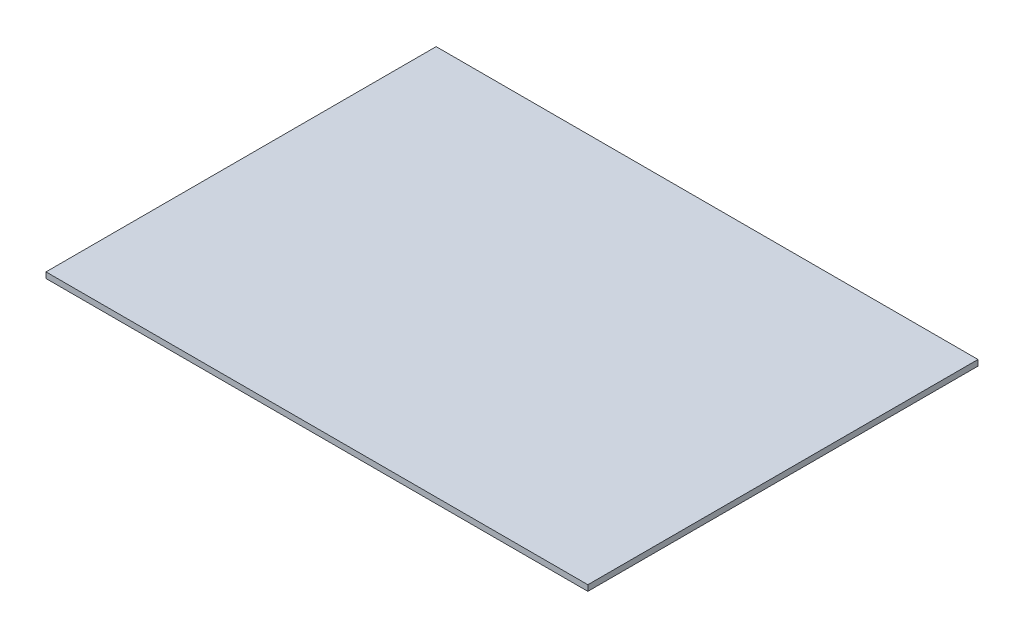
ISO-10303-21;
HEADER;
FILE_DESCRIPTION(('STEP AP214'),'2;1');
FILE_NAME('part.step','',(''),(''),'','','');
FILE_SCHEMA(('AUTOMOTIVE_DESIGN { 1 0 10303 214 1 1 1 1 }'));
ENDSEC;
DATA;
#1=APPLICATION_CONTEXT('core data for automotive mechanical design processes');
#2=APPLICATION_PROTOCOL_DEFINITION('international standard','automotive_design',2000,#1);
#3=PRODUCT_CONTEXT('',#1,'mechanical');
#4=PRODUCT('Part','Part','',(#3));
#5=PRODUCT_RELATED_PRODUCT_CATEGORY('part','',(#4));
#6=PRODUCT_DEFINITION_FORMATION('','',#4);
#7=PRODUCT_DEFINITION_CONTEXT('part definition',#1,'design');
#8=PRODUCT_DEFINITION('design','',#6,#7);
#9=PRODUCT_DEFINITION_SHAPE('','',#8);
#10=(LENGTH_UNIT() NAMED_UNIT(*) SI_UNIT(.MILLI.,.METRE.));
#11=(NAMED_UNIT(*) PLANE_ANGLE_UNIT() SI_UNIT($,.RADIAN.));
#12=(NAMED_UNIT(*) SI_UNIT($,.STERADIAN.) SOLID_ANGLE_UNIT());
#13=UNCERTAINTY_MEASURE_WITH_UNIT(LENGTH_MEASURE(1.E-05),#10,'distance_accuracy_value','');
#14=(GEOMETRIC_REPRESENTATION_CONTEXT(3) GLOBAL_UNCERTAINTY_ASSIGNED_CONTEXT((#13)) GLOBAL_UNIT_ASSIGNED_CONTEXT((#10,
#11,#12)) REPRESENTATION_CONTEXT('',''));
#15=CARTESIAN_POINT('',(0.,0.,0.));
#16=DIRECTION('',(0.,0.,1.));
#17=DIRECTION('',(1.,0.,0.));
#18=AXIS2_PLACEMENT_3D('',#15,#16,#17);
#19=CARTESIAN_POINT('',(75.,1.6,54.));
#20=DIRECTION('',(-1.,0.,0.));
#21=DIRECTION('',(0.,0.,1.));
#22=AXIS2_PLACEMENT_3D('',#19,#20,#21);
#23=PLANE('',#22);
#24=DIRECTION('',(0.,0.,-1.));
#25=VECTOR('',#24,1.);
#26=CARTESIAN_POINT('',(75.,0.,54.));
#27=LINE('',#26,#25);
#28=CARTESIAN_POINT('',(75.,0.,54.));
#29=VERTEX_POINT('',#28);
#30=CARTESIAN_POINT('',(75.,0.,-54.));
#31=VERTEX_POINT('',#30);
#32=EDGE_CURVE('E98',#29,#31,#27,.T.);
#33=ORIENTED_EDGE('',*,*,#32,.T.);
#34=DIRECTION('',(0.,-1.,0.));
#35=VECTOR('',#34,1.);
#36=CARTESIAN_POINT('',(75.,1.6,-54.));
#37=LINE('',#36,#35);
#38=CARTESIAN_POINT('',(75.,1.6,-54.));
#39=VERTEX_POINT('',#38);
#40=EDGE_CURVE('E11',#39,#31,#37,.T.);
#41=ORIENTED_EDGE('',*,*,#40,.F.);
#42=DIRECTION('',(0.,0.,-1.));
#43=VECTOR('',#42,1.);
#44=CARTESIAN_POINT('',(75.,1.6,54.));
#45=LINE('',#44,#43);
#46=CARTESIAN_POINT('',(75.,1.6,54.));
#47=VERTEX_POINT('',#46);
#48=EDGE_CURVE('E86',#47,#39,#45,.T.);
#49=ORIENTED_EDGE('',*,*,#48,.F.);
#50=DIRECTION('',(0.,-1.,0.));
#51=VECTOR('',#50,1.);
#52=CARTESIAN_POINT('',(75.,1.6,54.));
#53=LINE('',#52,#51);
#54=EDGE_CURVE('E94',#47,#29,#53,.T.);
#55=ORIENTED_EDGE('',*,*,#54,.T.);
#56=EDGE_LOOP('',(#33,#41,#49,#55));
#57=FACE_BOUND('',#56,.T.);
#58=ADVANCED_FACE('F35',(#57),#23,.F.);
#59=CARTESIAN_POINT('',(-75.,1.6,-54.));
#60=DIRECTION('',(0.,0.,1.));
#61=DIRECTION('',(1.,0.,0.));
#62=AXIS2_PLACEMENT_3D('',#59,#60,#61);
#63=PLANE('',#62);
#64=DIRECTION('',(-1.,0.,0.));
#65=VECTOR('',#64,1.);
#66=CARTESIAN_POINT('',(-75.,0.,-54.));
#67=LINE('',#66,#65);
#68=CARTESIAN_POINT('',(-75.,0.,-54.));
#69=VERTEX_POINT('',#68);
#70=EDGE_CURVE('E90',#31,#69,#67,.T.);
#71=ORIENTED_EDGE('',*,*,#70,.T.);
#72=DIRECTION('',(0.,-1.,0.));
#73=VECTOR('',#72,1.);
#74=CARTESIAN_POINT('',(-75.,1.6,-54.));
#75=LINE('',#74,#73);
#76=CARTESIAN_POINT('',(-75.,1.6,-54.));
#77=VERTEX_POINT('',#76);
#78=EDGE_CURVE('E43',#77,#69,#75,.T.);
#79=ORIENTED_EDGE('',*,*,#78,.F.);
#80=DIRECTION('',(-1.,0.,0.));
#81=VECTOR('',#80,1.);
#82=CARTESIAN_POINT('',(-75.,1.6,-54.));
#83=LINE('',#82,#81);
#84=EDGE_CURVE('E81',#39,#77,#83,.T.);
#85=ORIENTED_EDGE('',*,*,#84,.F.);
#86=ORIENTED_EDGE('',*,*,#40,.T.);
#87=EDGE_LOOP('',(#71,#79,#85,#86));
#88=FACE_BOUND('',#87,.T.);
#89=ADVANCED_FACE('F89',(#88),#63,.F.);
#90=CARTESIAN_POINT('',(-75.,1.6,54.));
#91=DIRECTION('',(1.,0.,0.));
#92=DIRECTION('',(0.,0.,-1.));
#93=AXIS2_PLACEMENT_3D('',#90,#91,#92);
#94=PLANE('',#93);
#95=DIRECTION('',(0.,0.,1.));
#96=VECTOR('',#95,1.);
#97=CARTESIAN_POINT('',(-75.,0.,54.));
#98=LINE('',#97,#96);
#99=CARTESIAN_POINT('',(-75.,0.,54.));
#100=VERTEX_POINT('',#99);
#101=EDGE_CURVE('E68',#69,#100,#98,.T.);
#102=ORIENTED_EDGE('',*,*,#101,.T.);
#103=DIRECTION('',(0.,-1.,0.));
#104=VECTOR('',#103,1.);
#105=CARTESIAN_POINT('',(-75.,1.6,54.));
#106=LINE('',#105,#104);
#107=CARTESIAN_POINT('',(-75.,1.6,54.));
#108=VERTEX_POINT('',#107);
#109=EDGE_CURVE('E91',#108,#100,#106,.T.);
#110=ORIENTED_EDGE('',*,*,#109,.F.);
#111=DIRECTION('',(0.,0.,1.));
#112=VECTOR('',#111,1.);
#113=CARTESIAN_POINT('',(-75.,1.6,54.));
#114=LINE('',#113,#112);
#115=EDGE_CURVE('E84',#77,#108,#114,.T.);
#116=ORIENTED_EDGE('',*,*,#115,.F.);
#117=ORIENTED_EDGE('',*,*,#78,.T.);
#118=EDGE_LOOP('',(#102,#110,#116,#117));
#119=FACE_BOUND('',#118,.T.);
#120=ADVANCED_FACE('F92',(#119),#94,.F.);
#121=CARTESIAN_POINT('',(-75.,1.6,54.));
#122=DIRECTION('',(0.,0.,-1.));
#123=DIRECTION('',(-1.,0.,0.));
#124=AXIS2_PLACEMENT_3D('',#121,#122,#123);
#125=PLANE('',#124);
#126=DIRECTION('',(1.,0.,0.));
#127=VECTOR('',#126,1.);
#128=CARTESIAN_POINT('',(-75.,0.,54.));
#129=LINE('',#128,#127);
#130=EDGE_CURVE('E74',#100,#29,#129,.T.);
#131=ORIENTED_EDGE('',*,*,#130,.T.);
#132=ORIENTED_EDGE('',*,*,#54,.F.);
#133=DIRECTION('',(1.,0.,0.));
#134=VECTOR('',#133,1.);
#135=CARTESIAN_POINT('',(-75.,1.6,54.));
#136=LINE('',#135,#134);
#137=EDGE_CURVE('E51',#108,#47,#136,.T.);
#138=ORIENTED_EDGE('',*,*,#137,.F.);
#139=ORIENTED_EDGE('',*,*,#109,.T.);
#140=EDGE_LOOP('',(#131,#132,#138,#139));
#141=FACE_BOUND('',#140,.T.);
#142=ADVANCED_FACE('F105',(#141),#125,.F.);
#143=CARTESIAN_POINT('',(0.,1.6,0.));
#144=DIRECTION('',(0.,-1.,0.));
#145=DIRECTION('',(0.,0.,-1.));
#146=AXIS2_PLACEMENT_3D('',#143,#144,#145);
#147=PLANE('',#146);
#148=ORIENTED_EDGE('',*,*,#48,.T.);
#149=ORIENTED_EDGE('',*,*,#84,.T.);
#150=ORIENTED_EDGE('',*,*,#115,.T.);
#151=ORIENTED_EDGE('',*,*,#137,.T.);
#152=EDGE_LOOP('',(#148,#149,#150,#151));
#153=FACE_BOUND('',#152,.T.);
#154=ADVANCED_FACE('F82',(#153),#147,.F.);
#155=CARTESIAN_POINT('',(0.,0.,0.));
#156=DIRECTION('',(0.,-1.,0.));
#157=DIRECTION('',(0.,0.,-1.));
#158=AXIS2_PLACEMENT_3D('',#155,#156,#157);
#159=PLANE('',#158);
#160=ORIENTED_EDGE('',*,*,#32,.F.);
#161=ORIENTED_EDGE('',*,*,#130,.F.);
#162=ORIENTED_EDGE('',*,*,#101,.F.);
#163=ORIENTED_EDGE('',*,*,#70,.F.);
#164=EDGE_LOOP('',(#160,#161,#162,#163));
#165=FACE_BOUND('',#164,.T.);
#166=ADVANCED_FACE('F108',(#165),#159,.T.);
#167=CLOSED_SHELL('',(#58,#89,#120,#142,#154,#166));
#168=MANIFOLD_SOLID_BREP('B2',#167);
#169=ADVANCED_BREP_SHAPE_REPRESENTATION('',(#18,#168),#14);
#170=SHAPE_DEFINITION_REPRESENTATION(#9,#169);
ENDSEC;
END-ISO-10303-21;
